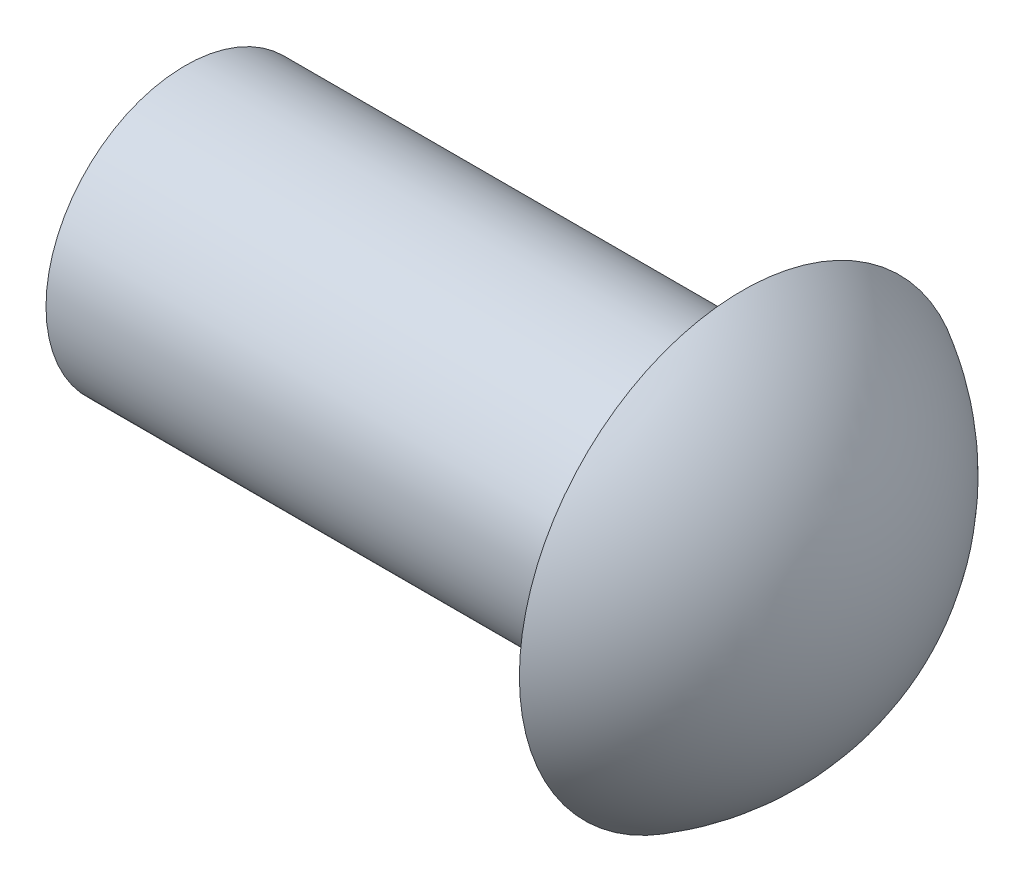
ISO-10303-21;
HEADER;
FILE_DESCRIPTION(('STEP AP214'),'2;1');
FILE_NAME('part.step','',(''),(''),'','','');
FILE_SCHEMA(('AUTOMOTIVE_DESIGN { 1 0 10303 214 1 1 1 1 }'));
ENDSEC;
DATA;
#1=APPLICATION_CONTEXT('core data for automotive mechanical design processes');
#2=APPLICATION_PROTOCOL_DEFINITION('international standard','automotive_design',2000,#1);
#3=PRODUCT_CONTEXT('',#1,'mechanical');
#4=PRODUCT('Part','Part','',(#3));
#5=PRODUCT_RELATED_PRODUCT_CATEGORY('part','',(#4));
#6=PRODUCT_DEFINITION_FORMATION('','',#4);
#7=PRODUCT_DEFINITION_CONTEXT('part definition',#1,'design');
#8=PRODUCT_DEFINITION('design','',#6,#7);
#9=PRODUCT_DEFINITION_SHAPE('','',#8);
#10=(LENGTH_UNIT() NAMED_UNIT(*) SI_UNIT(.MILLI.,.METRE.));
#11=(NAMED_UNIT(*) PLANE_ANGLE_UNIT() SI_UNIT($,.RADIAN.));
#12=(NAMED_UNIT(*) SI_UNIT($,.STERADIAN.) SOLID_ANGLE_UNIT());
#13=UNCERTAINTY_MEASURE_WITH_UNIT(LENGTH_MEASURE(1.E-05),#10,'distance_accuracy_value','');
#14=(GEOMETRIC_REPRESENTATION_CONTEXT(3) GLOBAL_UNCERTAINTY_ASSIGNED_CONTEXT((#13)) GLOBAL_UNIT_ASSIGNED_CONTEXT((#10,
#11,#12)) REPRESENTATION_CONTEXT('',''));
#15=CARTESIAN_POINT('',(0.,0.,0.));
#16=DIRECTION('',(0.,0.,1.));
#17=DIRECTION('',(1.,0.,0.));
#18=AXIS2_PLACEMENT_3D('',#15,#16,#17);
#19=CARTESIAN_POINT('',(0.,0.,0.));
#20=DIRECTION('',(1.,0.,0.));
#21=DIRECTION('',(0.,0.,-1.));
#22=AXIS2_PLACEMENT_3D('',#19,#20,#21);
#23=PLANE('',#22);
#24=CARTESIAN_POINT('',(0.,0.,0.));
#25=DIRECTION('',(-1.,0.,0.));
#26=DIRECTION('',(0.,0.,1.));
#27=AXIS2_PLACEMENT_3D('',#24,#25,#26);
#28=CIRCLE('',#27,7.5);
#29=CARTESIAN_POINT('',(0.,0.,7.5));
#30=VERTEX_POINT('',#29);
#31=EDGE_CURVE('E10',#30,#30,#28,.T.);
#32=ORIENTED_EDGE('',*,*,#31,.T.);
#33=EDGE_LOOP('',(#32));
#34=FACE_BOUND('',#33,.T.);
#35=ADVANCED_FACE('F41',(#34),#23,.F.);
#36=CARTESIAN_POINT('',(0.,0.,0.));
#37=DIRECTION('',(-1.,0.,0.));
#38=DIRECTION('',(0.,0.,1.));
#39=AXIS2_PLACEMENT_3D('',#36,#37,#38);
#40=CYLINDRICAL_SURFACE('',#39,7.5);
#41=ORIENTED_EDGE('',*,*,#31,.F.);
#42=EDGE_LOOP('',(#41));
#43=FACE_BOUND('',#42,.T.);
#44=CARTESIAN_POINT('',(30.,0.,0.));
#45=DIRECTION('',(-1.,0.,0.));
#46=DIRECTION('',(0.,0.,1.));
#47=AXIS2_PLACEMENT_3D('',#44,#45,#46);
#48=CIRCLE('',#47,7.5);
#49=CARTESIAN_POINT('',(30.,0.,7.5));
#50=VERTEX_POINT('',#49);
#51=EDGE_CURVE('E48',#50,#50,#48,.T.);
#52=ORIENTED_EDGE('',*,*,#51,.T.);
#53=EDGE_LOOP('',(#52));
#54=FACE_BOUND('',#53,.T.);
#55=ADVANCED_FACE('F69',(#43,#54),#40,.T.);
#56=CARTESIAN_POINT('',(30.,0.,-7.5));
#57=DIRECTION('',(1.,0.,0.));
#58=DIRECTION('',(0.,0.,-1.));
#59=AXIS2_PLACEMENT_3D('',#56,#57,#58);
#60=PLANE('',#59);
#61=ORIENTED_EDGE('',*,*,#51,.F.);
#62=EDGE_LOOP('',(#61));
#63=FACE_BOUND('',#62,.T.);
#64=CARTESIAN_POINT('',(30.,0.,0.));
#65=DIRECTION('',(-1.,0.,0.));
#66=DIRECTION('',(0.,0.,1.));
#67=AXIS2_PLACEMENT_3D('',#64,#65,#66);
#68=CIRCLE('',#67,12.);
#69=CARTESIAN_POINT('',(30.,0.,12.));
#70=VERTEX_POINT('',#69);
#71=EDGE_CURVE('E53',#70,#70,#68,.T.);
#72=ORIENTED_EDGE('',*,*,#71,.T.);
#73=EDGE_LOOP('',(#72));
#74=FACE_BOUND('',#73,.T.);
#75=ADVANCED_FACE('F61',(#63,#74),#60,.F.);
#76=CARTESIAN_POINT('',(23.2142857142857,0.,0.));
#77=DIRECTION('',(-1.,0.,0.));
#78=DIRECTION('',(0.,0.,-1.));
#79=AXIS2_PLACEMENT_3D('',#76,#77,#78);
#80=SPHERICAL_SURFACE('',#79,13.7857142857143);
#81=ORIENTED_EDGE('',*,*,#71,.F.);
#82=EDGE_LOOP('',(#81));
#83=FACE_BOUND('',#82,.T.);
#84=ADVANCED_FACE('F63',(#83),#80,.T.);
#85=CLOSED_SHELL('',(#35,#55,#75,#84));
#86=MANIFOLD_SOLID_BREP('B2',#85);
#87=ADVANCED_BREP_SHAPE_REPRESENTATION('',(#18,#86),#14);
#88=SHAPE_DEFINITION_REPRESENTATION(#9,#87);
ENDSEC;
END-ISO-10303-21;
